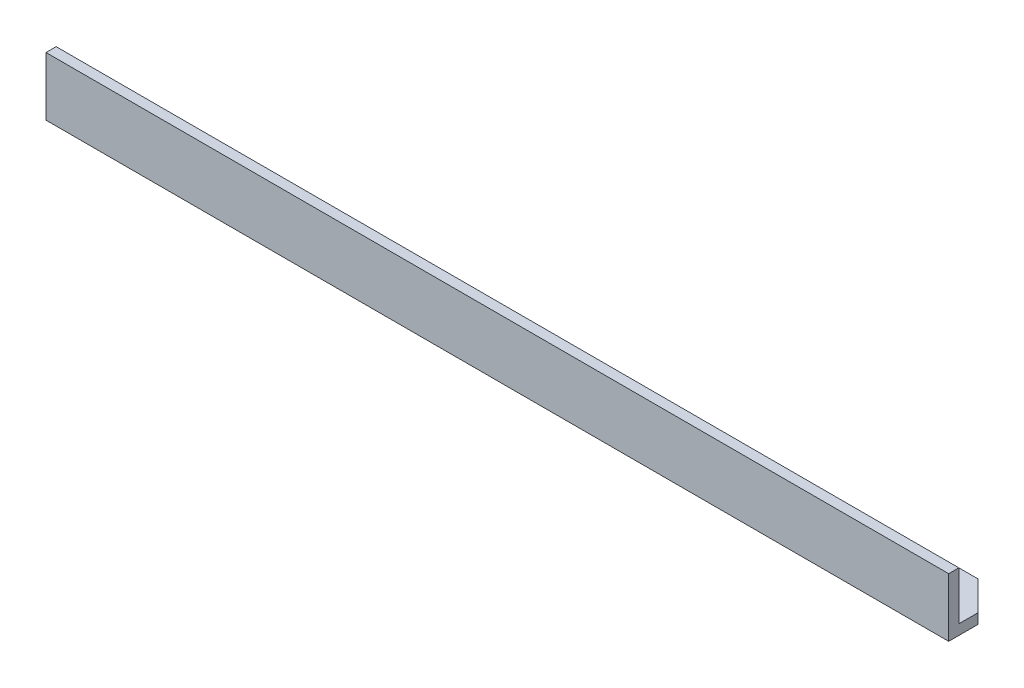
ISO-10303-21;
HEADER;
FILE_DESCRIPTION(('STEP AP214'),'2;1');
FILE_NAME('part.step','',(''),(''),'','','');
FILE_SCHEMA(('AUTOMOTIVE_DESIGN { 1 0 10303 214 1 1 1 1 }'));
ENDSEC;
DATA;
#1=APPLICATION_CONTEXT('core data for automotive mechanical design processes');
#2=APPLICATION_PROTOCOL_DEFINITION('international standard','automotive_design',2000,#1);
#3=PRODUCT_CONTEXT('',#1,'mechanical');
#4=PRODUCT('Part','Part','',(#3));
#5=PRODUCT_RELATED_PRODUCT_CATEGORY('part','',(#4));
#6=PRODUCT_DEFINITION_FORMATION('','',#4);
#7=PRODUCT_DEFINITION_CONTEXT('part definition',#1,'design');
#8=PRODUCT_DEFINITION('design','',#6,#7);
#9=PRODUCT_DEFINITION_SHAPE('','',#8);
#10=(LENGTH_UNIT() NAMED_UNIT(*) SI_UNIT(.MILLI.,.METRE.));
#11=(NAMED_UNIT(*) PLANE_ANGLE_UNIT() SI_UNIT($,.RADIAN.));
#12=(NAMED_UNIT(*) SI_UNIT($,.STERADIAN.) SOLID_ANGLE_UNIT());
#13=UNCERTAINTY_MEASURE_WITH_UNIT(LENGTH_MEASURE(1.E-05),#10,'distance_accuracy_value','');
#14=(GEOMETRIC_REPRESENTATION_CONTEXT(3) GLOBAL_UNCERTAINTY_ASSIGNED_CONTEXT((#13)) GLOBAL_UNIT_ASSIGNED_CONTEXT((#10,
#11,#12)) REPRESENTATION_CONTEXT('',''));
#15=CARTESIAN_POINT('',(0.,0.,0.));
#16=DIRECTION('',(0.,0.,1.));
#17=DIRECTION('',(1.,0.,0.));
#18=AXIS2_PLACEMENT_3D('',#15,#16,#17);
#19=CARTESIAN_POINT('',(308.,0.,-20.));
#20=DIRECTION('',(0.,0.,1.));
#21=DIRECTION('',(1.,0.,0.));
#22=AXIS2_PLACEMENT_3D('',#19,#20,#21);
#23=PLANE('',#22);
#24=DIRECTION('',(0.,-1.,0.));
#25=VECTOR('',#24,1.);
#26=CARTESIAN_POINT('',(5.,20.,-20.));
#27=LINE('',#26,#25);
#28=CARTESIAN_POINT('',(5.,3.46117846701572,-20.));
#29=VERTEX_POINT('',#28);
#30=CARTESIAN_POINT('',(5.,0.,-20.));
#31=VERTEX_POINT('',#30);
#32=EDGE_CURVE('E184',#29,#31,#27,.T.);
#33=ORIENTED_EDGE('',*,*,#32,.F.);
#34=DIRECTION('',(-1.,0.,0.));
#35=VECTOR('',#34,1.);
#36=CARTESIAN_POINT('',(308.,3.46117846701572,-20.));
#37=LINE('',#36,#35);
#38=CARTESIAN_POINT('',(298.,3.46117846701572,-20.));
#39=VERTEX_POINT('',#38);
#40=EDGE_CURVE('E153',#39,#29,#37,.T.);
#41=ORIENTED_EDGE('',*,*,#40,.F.);
#42=DIRECTION('',(0.,-1.,0.));
#43=VECTOR('',#42,1.);
#44=CARTESIAN_POINT('',(298.,20.,-20.));
#45=LINE('',#44,#43);
#46=CARTESIAN_POINT('',(298.,0.,-20.));
#47=VERTEX_POINT('',#46);
#48=EDGE_CURVE('E116',#39,#47,#45,.T.);
#49=ORIENTED_EDGE('',*,*,#48,.T.);
#50=DIRECTION('',(-1.,0.,0.));
#51=VECTOR('',#50,1.);
#52=CARTESIAN_POINT('',(308.,0.,-20.));
#53=LINE('',#52,#51);
#54=EDGE_CURVE('E114',#47,#31,#53,.T.);
#55=ORIENTED_EDGE('',*,*,#54,.T.);
#56=EDGE_LOOP('',(#33,#41,#49,#55));
#57=FACE_BOUND('',#56,.T.);
#58=ADVANCED_FACE('F37',(#57),#23,.F.);
#59=CARTESIAN_POINT('',(308.,0.,0.));
#60=DIRECTION('',(1.,0.,0.));
#61=DIRECTION('',(0.,0.,-1.));
#62=AXIS2_PLACEMENT_3D('',#59,#60,#61);
#63=PLANE('',#62);
#64=DIRECTION('',(0.,0.,-1.));
#65=VECTOR('',#64,1.);
#66=CARTESIAN_POINT('',(308.,0.,0.));
#67=LINE('',#66,#65);
#68=CARTESIAN_POINT('',(308.,0.,0.));
#69=VERTEX_POINT('',#68);
#70=CARTESIAN_POINT('',(308.,0.,-10.));
#71=VERTEX_POINT('',#70);
#72=EDGE_CURVE('E111',#69,#71,#67,.T.);
#73=ORIENTED_EDGE('',*,*,#72,.T.);
#74=DIRECTION('',(0.,1.,0.));
#75=VECTOR('',#74,1.);
#76=CARTESIAN_POINT('',(308.,0.,-10.));
#77=LINE('',#76,#75);
#78=CARTESIAN_POINT('',(308.,3.46117846701572,-10.));
#79=VERTEX_POINT('',#78);
#80=EDGE_CURVE('E11',#71,#79,#77,.T.);
#81=ORIENTED_EDGE('',*,*,#80,.T.);
#82=DIRECTION('',(0.,0.,1.));
#83=VECTOR('',#82,1.);
#84=CARTESIAN_POINT('',(308.,3.46117846701572,-20.));
#85=LINE('',#84,#83);
#86=CARTESIAN_POINT('',(308.,3.46117846701572,-3.46117846701572));
#87=VERTEX_POINT('',#86);
#88=EDGE_CURVE('E122',#79,#87,#85,.T.);
#89=ORIENTED_EDGE('',*,*,#88,.T.);
#90=DIRECTION('',(0.,1.,0.));
#91=VECTOR('',#90,1.);
#92=CARTESIAN_POINT('',(308.,3.46117846701572,-3.46117846701572));
#93=LINE('',#92,#91);
#94=CARTESIAN_POINT('',(308.,20.,-3.46117846701572));
#95=VERTEX_POINT('',#94);
#96=EDGE_CURVE('E124',#87,#95,#93,.T.);
#97=ORIENTED_EDGE('',*,*,#96,.T.);
#98=DIRECTION('',(0.,0.,1.));
#99=VECTOR('',#98,1.);
#100=CARTESIAN_POINT('',(308.,20.,-3.46117846701572));
#101=LINE('',#100,#99);
#102=CARTESIAN_POINT('',(308.,20.,0.));
#103=VERTEX_POINT('',#102);
#104=EDGE_CURVE('E131',#95,#103,#101,.T.);
#105=ORIENTED_EDGE('',*,*,#104,.T.);
#106=DIRECTION('',(0.,-1.,0.));
#107=VECTOR('',#106,1.);
#108=CARTESIAN_POINT('',(308.,20.,0.));
#109=LINE('',#108,#107);
#110=EDGE_CURVE('E120',#103,#69,#109,.T.);
#111=ORIENTED_EDGE('',*,*,#110,.T.);
#112=EDGE_LOOP('',(#73,#81,#89,#97,#105,#111));
#113=FACE_BOUND('',#112,.T.);
#114=ADVANCED_FACE('F118',(#113),#63,.T.);
#115=CARTESIAN_POINT('',(0.,0.,0.));
#116=DIRECTION('',(1.,0.,0.));
#117=DIRECTION('',(0.,0.,-1.));
#118=AXIS2_PLACEMENT_3D('',#115,#116,#117);
#119=PLANE('',#118);
#120=DIRECTION('',(0.,1.,0.));
#121=VECTOR('',#120,1.);
#122=CARTESIAN_POINT('',(0.,0.,-15.));
#123=LINE('',#122,#121);
#124=CARTESIAN_POINT('',(0.,0.,-15.));
#125=VERTEX_POINT('',#124);
#126=CARTESIAN_POINT('',(0.,3.46117846701572,-15.));
#127=VERTEX_POINT('',#126);
#128=EDGE_CURVE('E46',#125,#127,#123,.T.);
#129=ORIENTED_EDGE('',*,*,#128,.F.);
#130=DIRECTION('',(0.,0.,-1.));
#131=VECTOR('',#130,1.);
#132=CARTESIAN_POINT('',(0.,0.,0.));
#133=LINE('',#132,#131);
#134=CARTESIAN_POINT('',(0.,0.,0.));
#135=VERTEX_POINT('',#134);
#136=EDGE_CURVE('E137',#135,#125,#133,.T.);
#137=ORIENTED_EDGE('',*,*,#136,.F.);
#138=DIRECTION('',(0.,-1.,0.));
#139=VECTOR('',#138,1.);
#140=CARTESIAN_POINT('',(0.,20.,0.));
#141=LINE('',#140,#139);
#142=CARTESIAN_POINT('',(0.,20.,0.));
#143=VERTEX_POINT('',#142);
#144=EDGE_CURVE('E134',#143,#135,#141,.T.);
#145=ORIENTED_EDGE('',*,*,#144,.F.);
#146=DIRECTION('',(0.,0.,1.));
#147=VECTOR('',#146,1.);
#148=CARTESIAN_POINT('',(0.,20.,-3.46117846701572));
#149=LINE('',#148,#147);
#150=CARTESIAN_POINT('',(0.,20.,-3.46117846701572));
#151=VERTEX_POINT('',#150);
#152=EDGE_CURVE('E126',#151,#143,#149,.T.);
#153=ORIENTED_EDGE('',*,*,#152,.F.);
#154=DIRECTION('',(0.,1.,0.));
#155=VECTOR('',#154,1.);
#156=CARTESIAN_POINT('',(0.,3.46117846701572,-3.46117846701572));
#157=LINE('',#156,#155);
#158=CARTESIAN_POINT('',(0.,3.46117846701572,-3.46117846701572));
#159=VERTEX_POINT('',#158);
#160=EDGE_CURVE('E142',#159,#151,#157,.T.);
#161=ORIENTED_EDGE('',*,*,#160,.F.);
#162=DIRECTION('',(0.,0.,1.));
#163=VECTOR('',#162,1.);
#164=CARTESIAN_POINT('',(0.,3.46117846701572,-20.));
#165=LINE('',#164,#163);
#166=EDGE_CURVE('E140',#127,#159,#165,.T.);
#167=ORIENTED_EDGE('',*,*,#166,.F.);
#168=EDGE_LOOP('',(#129,#137,#145,#153,#161,#167));
#169=FACE_BOUND('',#168,.T.);
#170=ADVANCED_FACE('F172',(#169),#119,.F.);
#171=CARTESIAN_POINT('',(308.,20.,0.));
#172=DIRECTION('',(0.,0.,-1.));
#173=DIRECTION('',(0.,1.,0.));
#174=AXIS2_PLACEMENT_3D('',#171,#172,#173);
#175=PLANE('',#174);
#176=ORIENTED_EDGE('',*,*,#144,.T.);
#177=DIRECTION('',(-1.,0.,0.));
#178=VECTOR('',#177,1.);
#179=CARTESIAN_POINT('',(308.,0.,0.));
#180=LINE('',#179,#178);
#181=EDGE_CURVE('E157',#69,#135,#180,.T.);
#182=ORIENTED_EDGE('',*,*,#181,.F.);
#183=ORIENTED_EDGE('',*,*,#110,.F.);
#184=DIRECTION('',(-1.,0.,0.));
#185=VECTOR('',#184,1.);
#186=CARTESIAN_POINT('',(308.,20.,0.));
#187=LINE('',#186,#185);
#188=EDGE_CURVE('E133',#103,#143,#187,.T.);
#189=ORIENTED_EDGE('',*,*,#188,.T.);
#190=EDGE_LOOP('',(#176,#182,#183,#189));
#191=FACE_BOUND('',#190,.T.);
#192=ADVANCED_FACE('F39',(#191),#175,.F.);
#193=CARTESIAN_POINT('',(308.,0.,0.));
#194=DIRECTION('',(0.,1.,0.));
#195=DIRECTION('',(0.,0.,1.));
#196=AXIS2_PLACEMENT_3D('',#193,#194,#195);
#197=PLANE('',#196);
#198=DIRECTION('',(0.707106781186547,0.,-0.707106781186548));
#199=VECTOR('',#198,1.);
#200=CARTESIAN_POINT('',(5.,0.,-20.));
#201=LINE('',#200,#199);
#202=EDGE_CURVE('E60',#125,#31,#201,.T.);
#203=ORIENTED_EDGE('',*,*,#202,.T.);
#204=ORIENTED_EDGE('',*,*,#54,.F.);
#205=DIRECTION('',(0.707106781186548,0.,0.707106781186547));
#206=VECTOR('',#205,1.);
#207=CARTESIAN_POINT('',(308.,0.,-10.));
#208=LINE('',#207,#206);
#209=EDGE_CURVE('E101',#47,#71,#208,.T.);
#210=ORIENTED_EDGE('',*,*,#209,.T.);
#211=ORIENTED_EDGE('',*,*,#72,.F.);
#212=ORIENTED_EDGE('',*,*,#181,.T.);
#213=ORIENTED_EDGE('',*,*,#136,.T.);
#214=EDGE_LOOP('',(#203,#204,#210,#211,#212,#213));
#215=FACE_BOUND('',#214,.T.);
#216=CARTESIAN_POINT('',(278.,0.,-15.25));
#217=DIRECTION('',(0.,1.,0.));
#218=DIRECTION('',(0.,0.,1.));
#219=AXIS2_PLACEMENT_3D('',#216,#217,#218);
#220=CIRCLE('',#219,2.99999999999999);
#221=CARTESIAN_POINT('',(278.,0.,-12.25));
#222=VERTEX_POINT('',#221);
#223=EDGE_CURVE('E115',#222,#222,#220,.T.);
#224=ORIENTED_EDGE('',*,*,#223,.T.);
#225=EDGE_LOOP('',(#224));
#226=FACE_BOUND('',#225,.T.);
#227=ADVANCED_FACE('F108',(#215,#226),#197,.F.);
#228=CARTESIAN_POINT('',(308.,3.46117846701572,-20.));
#229=DIRECTION('',(0.,-1.,0.));
#230=DIRECTION('',(0.,0.,-1.));
#231=AXIS2_PLACEMENT_3D('',#228,#229,#230);
#232=PLANE('',#231);
#233=DIRECTION('',(0.707106781186547,0.,-0.707106781186548));
#234=VECTOR('',#233,1.);
#235=CARTESIAN_POINT('',(156.5,3.46117846701574,-171.5));
#236=LINE('',#235,#234);
#237=EDGE_CURVE('E161',#127,#29,#236,.T.);
#238=ORIENTED_EDGE('',*,*,#237,.F.);
#239=ORIENTED_EDGE('',*,*,#166,.T.);
#240=DIRECTION('',(-1.,0.,0.));
#241=VECTOR('',#240,1.);
#242=CARTESIAN_POINT('',(308.,3.46117846701572,-3.46117846701572));
#243=LINE('',#242,#241);
#244=EDGE_CURVE('E150',#87,#159,#243,.T.);
#245=ORIENTED_EDGE('',*,*,#244,.F.);
#246=ORIENTED_EDGE('',*,*,#88,.F.);
#247=DIRECTION('',(0.707106781186548,0.,0.707106781186547));
#248=VECTOR('',#247,1.);
#249=CARTESIAN_POINT('',(303.,3.46117846701572,-15.));
#250=LINE('',#249,#248);
#251=EDGE_CURVE('E53',#39,#79,#250,.T.);
#252=ORIENTED_EDGE('',*,*,#251,.F.);
#253=ORIENTED_EDGE('',*,*,#40,.T.);
#254=EDGE_LOOP('',(#238,#239,#245,#246,#252,#253));
#255=FACE_BOUND('',#254,.T.);
#256=CARTESIAN_POINT('',(278.,3.46117846701572,-15.25));
#257=DIRECTION('',(0.,-1.,0.));
#258=DIRECTION('',(0.,0.,-1.));
#259=AXIS2_PLACEMENT_3D('',#256,#257,#258);
#260=CIRCLE('',#259,2.99999999999999);
#261=CARTESIAN_POINT('',(278.,3.46117846701572,-18.25));
#262=VERTEX_POINT('',#261);
#263=EDGE_CURVE('E41',#262,#262,#260,.F.);
#264=ORIENTED_EDGE('',*,*,#263,.F.);
#265=EDGE_LOOP('',(#264));
#266=FACE_BOUND('',#265,.T.);
#267=ADVANCED_FACE('F166',(#255,#266),#232,.F.);
#268=CARTESIAN_POINT('',(308.,3.46117846701572,-3.46117846701572));
#269=DIRECTION('',(0.,0.,1.));
#270=DIRECTION('',(1.,0.,0.));
#271=AXIS2_PLACEMENT_3D('',#268,#269,#270);
#272=PLANE('',#271);
#273=ORIENTED_EDGE('',*,*,#160,.T.);
#274=DIRECTION('',(-1.,0.,0.));
#275=VECTOR('',#274,1.);
#276=CARTESIAN_POINT('',(308.,20.,-3.46117846701572));
#277=LINE('',#276,#275);
#278=EDGE_CURVE('E147',#95,#151,#277,.T.);
#279=ORIENTED_EDGE('',*,*,#278,.F.);
#280=ORIENTED_EDGE('',*,*,#96,.F.);
#281=ORIENTED_EDGE('',*,*,#244,.T.);
#282=EDGE_LOOP('',(#273,#279,#280,#281));
#283=FACE_BOUND('',#282,.T.);
#284=ADVANCED_FACE('F177',(#283),#272,.F.);
#285=CARTESIAN_POINT('',(308.,20.,-3.46117846701572));
#286=DIRECTION('',(0.,-1.,0.));
#287=DIRECTION('',(0.,0.,-1.));
#288=AXIS2_PLACEMENT_3D('',#285,#286,#287);
#289=PLANE('',#288);
#290=ORIENTED_EDGE('',*,*,#152,.T.);
#291=ORIENTED_EDGE('',*,*,#188,.F.);
#292=ORIENTED_EDGE('',*,*,#104,.F.);
#293=ORIENTED_EDGE('',*,*,#278,.T.);
#294=EDGE_LOOP('',(#290,#291,#292,#293));
#295=FACE_BOUND('',#294,.T.);
#296=ADVANCED_FACE('F181',(#295),#289,.F.);
#297=CARTESIAN_POINT('',(5.,20.,-20.));
#298=DIRECTION('',(-0.707106781186548,0.,-0.707106781186547));
#299=DIRECTION('',(-0.707106781186547,0.,0.707106781186548));
#300=AXIS2_PLACEMENT_3D('',#297,#298,#299);
#301=PLANE('',#300);
#302=ORIENTED_EDGE('',*,*,#237,.T.);
#303=ORIENTED_EDGE('',*,*,#32,.T.);
#304=ORIENTED_EDGE('',*,*,#202,.F.);
#305=ORIENTED_EDGE('',*,*,#128,.T.);
#306=EDGE_LOOP('',(#302,#303,#304,#305));
#307=FACE_BOUND('',#306,.T.);
#308=ADVANCED_FACE('F160',(#307),#301,.T.);
#309=CARTESIAN_POINT('',(308.,20.,-10.));
#310=DIRECTION('',(0.707106781186547,0.,-0.707106781186548));
#311=DIRECTION('',(-0.707106781186548,0.,-0.707106781186547));
#312=AXIS2_PLACEMENT_3D('',#309,#310,#311);
#313=PLANE('',#312);
#314=ORIENTED_EDGE('',*,*,#251,.T.);
#315=ORIENTED_EDGE('',*,*,#80,.F.);
#316=ORIENTED_EDGE('',*,*,#209,.F.);
#317=ORIENTED_EDGE('',*,*,#48,.F.);
#318=EDGE_LOOP('',(#314,#315,#316,#317));
#319=FACE_BOUND('',#318,.T.);
#320=ADVANCED_FACE('F100',(#319),#313,.T.);
#321=CARTESIAN_POINT('',(278.,20.,-15.25));
#322=DIRECTION('',(0.,-1.,0.));
#323=DIRECTION('',(0.,0.,-1.));
#324=AXIS2_PLACEMENT_3D('',#321,#322,#323);
#325=CYLINDRICAL_SURFACE('',#324,2.99999999999999);
#326=ORIENTED_EDGE('',*,*,#223,.F.);
#327=EDGE_LOOP('',(#326));
#328=FACE_BOUND('',#327,.T.);
#329=ORIENTED_EDGE('',*,*,#263,.T.);
#330=EDGE_LOOP('',(#329));
#331=FACE_BOUND('',#330,.T.);
#332=ADVANCED_FACE('F192',(#328,#331),#325,.F.);
#333=CLOSED_SHELL('',(#58,#114,#170,#192,#227,#267,#284,#296,#308,#320,#332));
#334=MANIFOLD_SOLID_BREP('B2',#333);
#335=ADVANCED_BREP_SHAPE_REPRESENTATION('',(#18,#334),#14);
#336=SHAPE_DEFINITION_REPRESENTATION(#9,#335);
ENDSEC;
END-ISO-10303-21;
